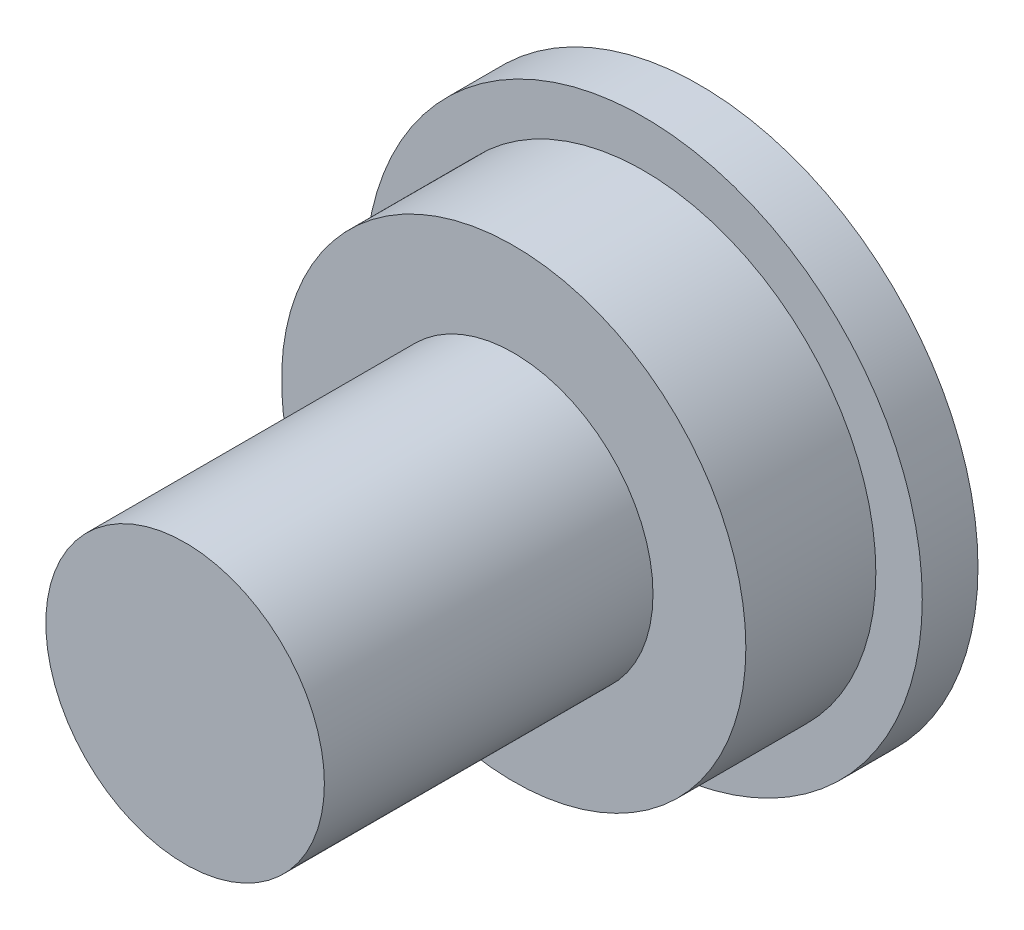
ISO-10303-21;
HEADER;
FILE_DESCRIPTION(('STEP AP214'),'2;1');
FILE_NAME('part.step','',(''),(''),'','','');
FILE_SCHEMA(('AUTOMOTIVE_DESIGN { 1 0 10303 214 1 1 1 1 }'));
ENDSEC;
DATA;
#1=APPLICATION_CONTEXT('core data for automotive mechanical design processes');
#2=APPLICATION_PROTOCOL_DEFINITION('international standard','automotive_design',2000,#1);
#3=PRODUCT_CONTEXT('',#1,'mechanical');
#4=PRODUCT('Part','Part','',(#3));
#5=PRODUCT_RELATED_PRODUCT_CATEGORY('part','',(#4));
#6=PRODUCT_DEFINITION_FORMATION('','',#4);
#7=PRODUCT_DEFINITION_CONTEXT('part definition',#1,'design');
#8=PRODUCT_DEFINITION('design','',#6,#7);
#9=PRODUCT_DEFINITION_SHAPE('','',#8);
#10=(LENGTH_UNIT() NAMED_UNIT(*) SI_UNIT(.MILLI.,.METRE.));
#11=(NAMED_UNIT(*) PLANE_ANGLE_UNIT() SI_UNIT($,.RADIAN.));
#12=(NAMED_UNIT(*) SI_UNIT($,.STERADIAN.) SOLID_ANGLE_UNIT());
#13=UNCERTAINTY_MEASURE_WITH_UNIT(LENGTH_MEASURE(1.E-05),#10,'distance_accuracy_value','');
#14=(GEOMETRIC_REPRESENTATION_CONTEXT(3) GLOBAL_UNCERTAINTY_ASSIGNED_CONTEXT((#13)) GLOBAL_UNIT_ASSIGNED_CONTEXT((#10,
#11,#12)) REPRESENTATION_CONTEXT('',''));
#15=CARTESIAN_POINT('',(0.,0.,0.));
#16=DIRECTION('',(0.,0.,1.));
#17=DIRECTION('',(1.,0.,0.));
#18=AXIS2_PLACEMENT_3D('',#15,#16,#17);
#19=CARTESIAN_POINT('',(0.,0.,10.));
#20=DIRECTION('',(0.,0.,-1.));
#21=DIRECTION('',(-1.,0.,0.));
#22=AXIS2_PLACEMENT_3D('',#19,#20,#21);
#23=CYLINDRICAL_SURFACE('',#22,15.);
#24=CARTESIAN_POINT('',(0.,0.,0.));
#25=DIRECTION('',(0.,0.,1.));
#26=DIRECTION('',(1.,0.,0.));
#27=AXIS2_PLACEMENT_3D('',#24,#25,#26);
#28=CIRCLE('',#27,15.);
#29=CARTESIAN_POINT('',(15.,0.,0.));
#30=VERTEX_POINT('',#29);
#31=EDGE_CURVE('E35',#30,#30,#28,.T.);
#32=ORIENTED_EDGE('',*,*,#31,.T.);
#33=EDGE_LOOP('',(#32));
#34=FACE_BOUND('',#33,.T.);
#35=CARTESIAN_POINT('',(0.,0.,3.));
#36=DIRECTION('',(0.,0.,1.));
#37=DIRECTION('',(1.,0.,0.));
#38=AXIS2_PLACEMENT_3D('',#35,#36,#37);
#39=CIRCLE('',#38,15.);
#40=CARTESIAN_POINT('',(15.,0.,3.));
#41=VERTEX_POINT('',#40);
#42=EDGE_CURVE('E43',#41,#41,#39,.T.);
#43=ORIENTED_EDGE('',*,*,#42,.F.);
#44=EDGE_LOOP('',(#43));
#45=FACE_BOUND('',#44,.T.);
#46=ADVANCED_FACE('F32',(#34,#45),#23,.T.);
#47=CARTESIAN_POINT('',(0.,0.,0.));
#48=DIRECTION('',(0.,0.,1.));
#49=DIRECTION('',(1.,0.,0.));
#50=AXIS2_PLACEMENT_3D('',#47,#48,#49);
#51=PLANE('',#50);
#52=ORIENTED_EDGE('',*,*,#31,.F.);
#53=EDGE_LOOP('',(#52));
#54=FACE_BOUND('',#53,.T.);
#55=ADVANCED_FACE('F58',(#54),#51,.F.);
#56=CARTESIAN_POINT('',(0.,0.,3.));
#57=DIRECTION('',(0.,0.,1.));
#58=DIRECTION('',(1.,0.,0.));
#59=AXIS2_PLACEMENT_3D('',#56,#57,#58);
#60=PLANE('',#59);
#61=CARTESIAN_POINT('',(0.,0.,3.));
#62=DIRECTION('',(0.,0.,1.));
#63=DIRECTION('',(1.,0.,0.));
#64=AXIS2_PLACEMENT_3D('',#61,#62,#63);
#65=CIRCLE('',#64,12.5);
#66=CARTESIAN_POINT('',(12.5,0.,3.));
#67=VERTEX_POINT('',#66);
#68=EDGE_CURVE('E47',#67,#67,#65,.T.);
#69=ORIENTED_EDGE('',*,*,#68,.F.);
#70=EDGE_LOOP('',(#69));
#71=FACE_BOUND('',#70,.T.);
#72=ORIENTED_EDGE('',*,*,#42,.T.);
#73=EDGE_LOOP('',(#72));
#74=FACE_BOUND('',#73,.T.);
#75=ADVANCED_FACE('F55',(#71,#74),#60,.T.);
#76=CARTESIAN_POINT('',(0.,0.,3.));
#77=DIRECTION('',(0.,0.,1.));
#78=DIRECTION('',(1.,0.,0.));
#79=AXIS2_PLACEMENT_3D('',#76,#77,#78);
#80=CYLINDRICAL_SURFACE('',#79,12.5);
#81=ORIENTED_EDGE('',*,*,#68,.T.);
#82=EDGE_LOOP('',(#81));
#83=FACE_BOUND('',#82,.T.);
#84=CARTESIAN_POINT('',(0.,0.,10.));
#85=DIRECTION('',(0.,0.,1.));
#86=DIRECTION('',(1.,0.,0.));
#87=AXIS2_PLACEMENT_3D('',#84,#85,#86);
#88=CIRCLE('',#87,12.5);
#89=CARTESIAN_POINT('',(12.5,0.,10.));
#90=VERTEX_POINT('',#89);
#91=EDGE_CURVE('E50',#90,#90,#88,.T.);
#92=ORIENTED_EDGE('',*,*,#91,.F.);
#93=EDGE_LOOP('',(#92));
#94=FACE_BOUND('',#93,.T.);
#95=ADVANCED_FACE('F68',(#83,#94),#80,.T.);
#96=CARTESIAN_POINT('',(0.,0.,10.));
#97=DIRECTION('',(0.,0.,1.));
#98=DIRECTION('',(1.,0.,0.));
#99=AXIS2_PLACEMENT_3D('',#96,#97,#98);
#100=PLANE('',#99);
#101=CARTESIAN_POINT('',(0.,0.,10.));
#102=DIRECTION('',(0.,0.,1.));
#103=DIRECTION('',(1.,0.,0.));
#104=AXIS2_PLACEMENT_3D('',#101,#102,#103);
#105=CIRCLE('',#104,7.5);
#106=CARTESIAN_POINT('',(7.5,0.,10.));
#107=VERTEX_POINT('',#106);
#108=EDGE_CURVE('E10',#107,#107,#105,.T.);
#109=ORIENTED_EDGE('',*,*,#108,.F.);
#110=EDGE_LOOP('',(#109));
#111=FACE_BOUND('',#110,.T.);
#112=ORIENTED_EDGE('',*,*,#91,.T.);
#113=EDGE_LOOP('',(#112));
#114=FACE_BOUND('',#113,.T.);
#115=ADVANCED_FACE('F72',(#111,#114),#100,.T.);
#116=CARTESIAN_POINT('',(0.,0.,27.695));
#117=DIRECTION('',(0.,0.,-1.));
#118=DIRECTION('',(-1.,0.,0.));
#119=AXIS2_PLACEMENT_3D('',#116,#117,#118);
#120=CYLINDRICAL_SURFACE('',#119,7.5);
#121=CARTESIAN_POINT('',(0.,0.,27.695));
#122=DIRECTION('',(0.,0.,1.));
#123=DIRECTION('',(1.,0.,0.));
#124=AXIS2_PLACEMENT_3D('',#121,#122,#123);
#125=CIRCLE('',#124,7.5);
#126=CARTESIAN_POINT('',(7.5,0.,27.695));
#127=VERTEX_POINT('',#126);
#128=EDGE_CURVE('E46',#127,#127,#125,.T.);
#129=ORIENTED_EDGE('',*,*,#128,.F.);
#130=EDGE_LOOP('',(#129));
#131=FACE_BOUND('',#130,.T.);
#132=ORIENTED_EDGE('',*,*,#108,.T.);
#133=EDGE_LOOP('',(#132));
#134=FACE_BOUND('',#133,.T.);
#135=ADVANCED_FACE('F74',(#131,#134),#120,.T.);
#136=CARTESIAN_POINT('',(0.,0.,27.695));
#137=DIRECTION('',(0.,0.,1.));
#138=DIRECTION('',(1.,0.,0.));
#139=AXIS2_PLACEMENT_3D('',#136,#137,#138);
#140=PLANE('',#139);
#141=ORIENTED_EDGE('',*,*,#128,.T.);
#142=EDGE_LOOP('',(#141));
#143=FACE_BOUND('',#142,.T.);
#144=ADVANCED_FACE('F82',(#143),#140,.T.);
#145=CLOSED_SHELL('',(#46,#55,#75,#95,#115,#135,#144));
#146=MANIFOLD_SOLID_BREP('B2',#145);
#147=ADVANCED_BREP_SHAPE_REPRESENTATION('',(#18,#146),#14);
#148=SHAPE_DEFINITION_REPRESENTATION(#9,#147);
ENDSEC;
END-ISO-10303-21;
